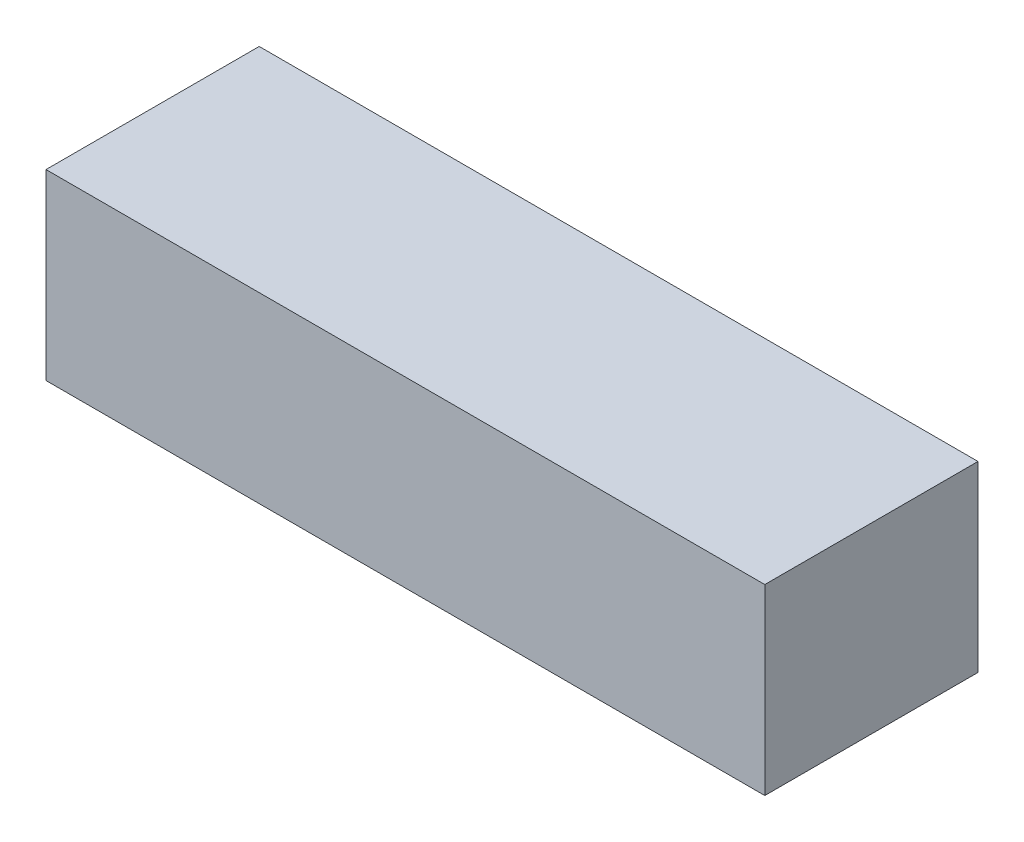
ISO-10303-21;
HEADER;
FILE_DESCRIPTION(('STEP AP214'),'2;1');
FILE_NAME('part.step','',(''),(''),'','','');
FILE_SCHEMA(('AUTOMOTIVE_DESIGN { 1 0 10303 214 1 1 1 1 }'));
ENDSEC;
DATA;
#1=APPLICATION_CONTEXT('core data for automotive mechanical design processes');
#2=APPLICATION_PROTOCOL_DEFINITION('international standard','automotive_design',2000,#1);
#3=PRODUCT_CONTEXT('',#1,'mechanical');
#4=PRODUCT('Part','Part','',(#3));
#5=PRODUCT_RELATED_PRODUCT_CATEGORY('part','',(#4));
#6=PRODUCT_DEFINITION_FORMATION('','',#4);
#7=PRODUCT_DEFINITION_CONTEXT('part definition',#1,'design');
#8=PRODUCT_DEFINITION('design','',#6,#7);
#9=PRODUCT_DEFINITION_SHAPE('','',#8);
#10=(LENGTH_UNIT() NAMED_UNIT(*) SI_UNIT(.MILLI.,.METRE.));
#11=(NAMED_UNIT(*) PLANE_ANGLE_UNIT() SI_UNIT($,.RADIAN.));
#12=(NAMED_UNIT(*) SI_UNIT($,.STERADIAN.) SOLID_ANGLE_UNIT());
#13=UNCERTAINTY_MEASURE_WITH_UNIT(LENGTH_MEASURE(1.E-05),#10,'distance_accuracy_value','');
#14=(GEOMETRIC_REPRESENTATION_CONTEXT(3) GLOBAL_UNCERTAINTY_ASSIGNED_CONTEXT((#13)) GLOBAL_UNIT_ASSIGNED_CONTEXT((#10,
#11,#12)) REPRESENTATION_CONTEXT('',''));
#15=CARTESIAN_POINT('',(0.,0.,0.));
#16=DIRECTION('',(0.,0.,1.));
#17=DIRECTION('',(1.,0.,0.));
#18=AXIS2_PLACEMENT_3D('',#15,#16,#17);
#19=CARTESIAN_POINT('',(0.,0.,35.));
#20=DIRECTION('',(1.,0.,0.));
#21=DIRECTION('',(0.,1.,0.));
#22=AXIS2_PLACEMENT_3D('',#19,#20,#21);
#23=PLANE('',#22);
#24=DIRECTION('',(0.,-1.,0.));
#25=VECTOR('',#24,1.);
#26=CARTESIAN_POINT('',(0.,0.,0.));
#27=LINE('',#26,#25);
#28=CARTESIAN_POINT('',(0.,0.,0.));
#29=VERTEX_POINT('',#28);
#30=CARTESIAN_POINT('',(0.,-30.,0.));
#31=VERTEX_POINT('',#30);
#32=EDGE_CURVE('E102',#29,#31,#27,.T.);
#33=ORIENTED_EDGE('',*,*,#32,.T.);
#34=DIRECTION('',(0.,0.,-1.));
#35=VECTOR('',#34,1.);
#36=CARTESIAN_POINT('',(0.,-30.,35.));
#37=LINE('',#36,#35);
#38=CARTESIAN_POINT('',(0.,-30.,35.));
#39=VERTEX_POINT('',#38);
#40=EDGE_CURVE('E11',#39,#31,#37,.T.);
#41=ORIENTED_EDGE('',*,*,#40,.F.);
#42=DIRECTION('',(0.,-1.,0.));
#43=VECTOR('',#42,1.);
#44=CARTESIAN_POINT('',(0.,0.,35.));
#45=LINE('',#44,#43);
#46=CARTESIAN_POINT('',(0.,0.,35.));
#47=VERTEX_POINT('',#46);
#48=EDGE_CURVE('E90',#47,#39,#45,.T.);
#49=ORIENTED_EDGE('',*,*,#48,.F.);
#50=DIRECTION('',(0.,0.,-1.));
#51=VECTOR('',#50,1.);
#52=CARTESIAN_POINT('',(0.,0.,35.));
#53=LINE('',#52,#51);
#54=EDGE_CURVE('E98',#47,#29,#53,.T.);
#55=ORIENTED_EDGE('',*,*,#54,.T.);
#56=EDGE_LOOP('',(#33,#41,#49,#55));
#57=FACE_BOUND('',#56,.T.);
#58=ADVANCED_FACE('F39',(#57),#23,.F.);
#59=CARTESIAN_POINT('',(0.,-30.,35.));
#60=DIRECTION('',(0.,1.,0.));
#61=DIRECTION('',(0.,0.,1.));
#62=AXIS2_PLACEMENT_3D('',#59,#60,#61);
#63=PLANE('',#62);
#64=DIRECTION('',(1.,0.,0.));
#65=VECTOR('',#64,1.);
#66=CARTESIAN_POINT('',(0.,-30.,0.));
#67=LINE('',#66,#65);
#68=CARTESIAN_POINT('',(118.,-30.,0.));
#69=VERTEX_POINT('',#68);
#70=EDGE_CURVE('E94',#31,#69,#67,.T.);
#71=ORIENTED_EDGE('',*,*,#70,.T.);
#72=DIRECTION('',(0.,0.,-1.));
#73=VECTOR('',#72,1.);
#74=CARTESIAN_POINT('',(118.,-30.,35.));
#75=LINE('',#74,#73);
#76=CARTESIAN_POINT('',(118.,-30.,35.));
#77=VERTEX_POINT('',#76);
#78=EDGE_CURVE('E47',#77,#69,#75,.T.);
#79=ORIENTED_EDGE('',*,*,#78,.F.);
#80=DIRECTION('',(1.,0.,0.));
#81=VECTOR('',#80,1.);
#82=CARTESIAN_POINT('',(0.,-30.,35.));
#83=LINE('',#82,#81);
#84=EDGE_CURVE('E85',#39,#77,#83,.T.);
#85=ORIENTED_EDGE('',*,*,#84,.F.);
#86=ORIENTED_EDGE('',*,*,#40,.T.);
#87=EDGE_LOOP('',(#71,#79,#85,#86));
#88=FACE_BOUND('',#87,.T.);
#89=ADVANCED_FACE('F93',(#88),#63,.F.);
#90=CARTESIAN_POINT('',(118.,0.,35.));
#91=DIRECTION('',(-1.,0.,0.));
#92=DIRECTION('',(0.,0.,1.));
#93=AXIS2_PLACEMENT_3D('',#90,#91,#92);
#94=PLANE('',#93);
#95=DIRECTION('',(0.,1.,0.));
#96=VECTOR('',#95,1.);
#97=CARTESIAN_POINT('',(118.,0.,0.));
#98=LINE('',#97,#96);
#99=CARTESIAN_POINT('',(118.,0.,0.));
#100=VERTEX_POINT('',#99);
#101=EDGE_CURVE('E72',#69,#100,#98,.T.);
#102=ORIENTED_EDGE('',*,*,#101,.T.);
#103=DIRECTION('',(0.,0.,-1.));
#104=VECTOR('',#103,1.);
#105=CARTESIAN_POINT('',(118.,0.,35.));
#106=LINE('',#105,#104);
#107=CARTESIAN_POINT('',(118.,0.,35.));
#108=VERTEX_POINT('',#107);
#109=EDGE_CURVE('E95',#108,#100,#106,.T.);
#110=ORIENTED_EDGE('',*,*,#109,.F.);
#111=DIRECTION('',(0.,1.,0.));
#112=VECTOR('',#111,1.);
#113=CARTESIAN_POINT('',(118.,0.,35.));
#114=LINE('',#113,#112);
#115=EDGE_CURVE('E88',#77,#108,#114,.T.);
#116=ORIENTED_EDGE('',*,*,#115,.F.);
#117=ORIENTED_EDGE('',*,*,#78,.T.);
#118=EDGE_LOOP('',(#102,#110,#116,#117));
#119=FACE_BOUND('',#118,.T.);
#120=ADVANCED_FACE('F96',(#119),#94,.F.);
#121=CARTESIAN_POINT('',(0.,0.,35.));
#122=DIRECTION('',(0.,-1.,0.));
#123=DIRECTION('',(0.,0.,-1.));
#124=AXIS2_PLACEMENT_3D('',#121,#122,#123);
#125=PLANE('',#124);
#126=DIRECTION('',(-1.,0.,0.));
#127=VECTOR('',#126,1.);
#128=CARTESIAN_POINT('',(0.,0.,0.));
#129=LINE('',#128,#127);
#130=EDGE_CURVE('E78',#100,#29,#129,.T.);
#131=ORIENTED_EDGE('',*,*,#130,.T.);
#132=ORIENTED_EDGE('',*,*,#54,.F.);
#133=DIRECTION('',(-1.,0.,0.));
#134=VECTOR('',#133,1.);
#135=CARTESIAN_POINT('',(0.,0.,35.));
#136=LINE('',#135,#134);
#137=EDGE_CURVE('E55',#108,#47,#136,.T.);
#138=ORIENTED_EDGE('',*,*,#137,.F.);
#139=ORIENTED_EDGE('',*,*,#109,.T.);
#140=EDGE_LOOP('',(#131,#132,#138,#139));
#141=FACE_BOUND('',#140,.T.);
#142=ADVANCED_FACE('F109',(#141),#125,.F.);
#143=CARTESIAN_POINT('',(0.,0.,35.));
#144=DIRECTION('',(0.,0.,1.));
#145=DIRECTION('',(1.,0.,0.));
#146=AXIS2_PLACEMENT_3D('',#143,#144,#145);
#147=PLANE('',#146);
#148=ORIENTED_EDGE('',*,*,#48,.T.);
#149=ORIENTED_EDGE('',*,*,#84,.T.);
#150=ORIENTED_EDGE('',*,*,#115,.T.);
#151=ORIENTED_EDGE('',*,*,#137,.T.);
#152=EDGE_LOOP('',(#148,#149,#150,#151));
#153=FACE_BOUND('',#152,.T.);
#154=ADVANCED_FACE('F86',(#153),#147,.T.);
#155=CARTESIAN_POINT('',(0.,0.,0.));
#156=DIRECTION('',(0.,0.,1.));
#157=DIRECTION('',(1.,0.,0.));
#158=AXIS2_PLACEMENT_3D('',#155,#156,#157);
#159=PLANE('',#158);
#160=ORIENTED_EDGE('',*,*,#32,.F.);
#161=ORIENTED_EDGE('',*,*,#130,.F.);
#162=ORIENTED_EDGE('',*,*,#101,.F.);
#163=ORIENTED_EDGE('',*,*,#70,.F.);
#164=EDGE_LOOP('',(#160,#161,#162,#163));
#165=FACE_BOUND('',#164,.T.);
#166=ADVANCED_FACE('F112',(#165),#159,.F.);
#167=CLOSED_SHELL('',(#58,#89,#120,#142,#154,#166));
#168=MANIFOLD_SOLID_BREP('B2',#167);
#169=ADVANCED_BREP_SHAPE_REPRESENTATION('',(#18,#168),#14);
#170=SHAPE_DEFINITION_REPRESENTATION(#9,#169);
ENDSEC;
END-ISO-10303-21;
